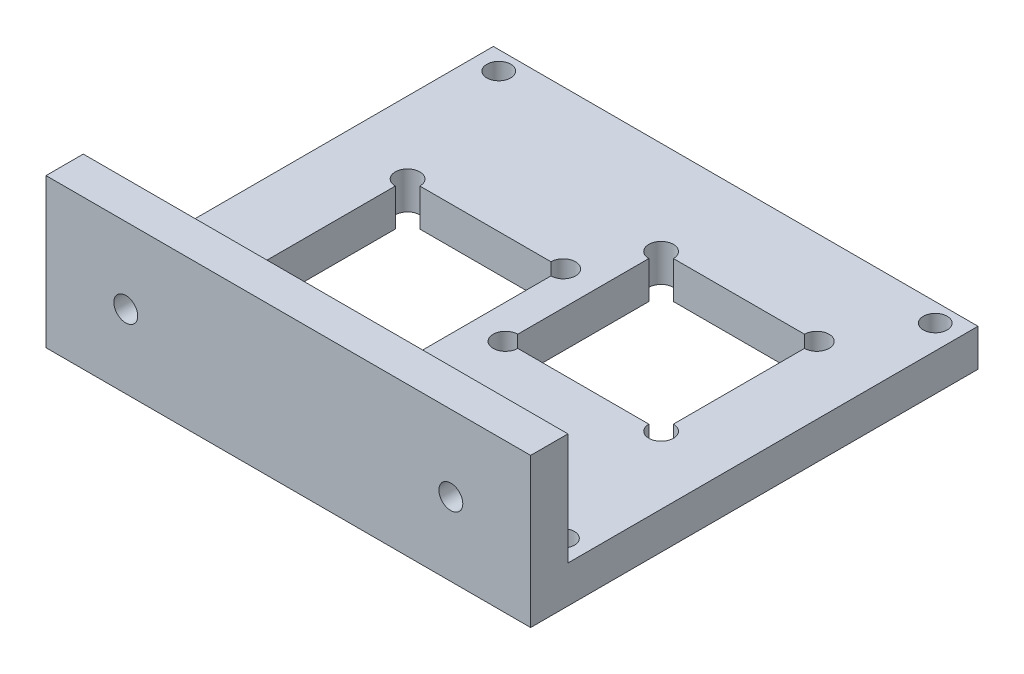
ISO-10303-21;
HEADER;
FILE_DESCRIPTION(('STEP AP214'),'2;1');
FILE_NAME('part.step','',(''),(''),'','','');
FILE_SCHEMA(('AUTOMOTIVE_DESIGN { 1 0 10303 214 1 1 1 1 }'));
ENDSEC;
DATA;
#1=APPLICATION_CONTEXT('core data for automotive mechanical design processes');
#2=APPLICATION_PROTOCOL_DEFINITION('international standard','automotive_design',2000,#1);
#3=PRODUCT_CONTEXT('',#1,'mechanical');
#4=PRODUCT('Part','Part','',(#3));
#5=PRODUCT_RELATED_PRODUCT_CATEGORY('part','',(#4));
#6=PRODUCT_DEFINITION_FORMATION('','',#4);
#7=PRODUCT_DEFINITION_CONTEXT('part definition',#1,'design');
#8=PRODUCT_DEFINITION('design','',#6,#7);
#9=PRODUCT_DEFINITION_SHAPE('','',#8);
#10=(LENGTH_UNIT() NAMED_UNIT(*) SI_UNIT(.MILLI.,.METRE.));
#11=(NAMED_UNIT(*) PLANE_ANGLE_UNIT() SI_UNIT($,.RADIAN.));
#12=(NAMED_UNIT(*) SI_UNIT($,.STERADIAN.) SOLID_ANGLE_UNIT());
#13=UNCERTAINTY_MEASURE_WITH_UNIT(LENGTH_MEASURE(1.E-05),#10,'distance_accuracy_value','');
#14=(GEOMETRIC_REPRESENTATION_CONTEXT(3) GLOBAL_UNCERTAINTY_ASSIGNED_CONTEXT((#13)) GLOBAL_UNIT_ASSIGNED_CONTEXT((#10,
#11,#12)) REPRESENTATION_CONTEXT('',''));
#15=CARTESIAN_POINT('',(0.,0.,0.));
#16=DIRECTION('',(0.,0.,1.));
#17=DIRECTION('',(1.,0.,0.));
#18=AXIS2_PLACEMENT_3D('',#15,#16,#17);
#19=CARTESIAN_POINT('',(0.,5.,0.));
#20=DIRECTION('',(0.,1.,0.));
#21=DIRECTION('',(0.,0.,1.));
#22=AXIS2_PLACEMENT_3D('',#19,#20,#21);
#23=PLANE('',#22);
#24=CARTESIAN_POINT('',(29.4502152782406,5.,-11.5634424045139));
#25=DIRECTION('',(0.,1.,0.));
#26=DIRECTION('',(0.,0.,1.));
#27=AXIS2_PLACEMENT_3D('',#24,#25,#26);
#28=CIRCLE('',#27,1.65);
#29=CARTESIAN_POINT('',(29.4502152782406,5.,-9.91344240451395));
#30=VERTEX_POINT('',#29);
#31=CARTESIAN_POINT('',(27.8002152782406,5.,-11.5634424045139));
#32=VERTEX_POINT('',#31);
#33=EDGE_CURVE('E351',#30,#32,#28,.T.);
#34=ORIENTED_EDGE('',*,*,#33,.F.);
#35=DIRECTION('',(0.,0.,1.));
#36=VECTOR('',#35,1.);
#37=CARTESIAN_POINT('',(29.4502152782406,5.,0.));
#38=LINE('',#37,#36);
#39=CARTESIAN_POINT('',(29.4502152782406,5.,7.66655759548606));
#40=VERTEX_POINT('',#39);
#41=EDGE_CURVE('E348',#30,#40,#38,.T.);
#42=ORIENTED_EDGE('',*,*,#41,.T.);
#43=CARTESIAN_POINT('',(29.4502152782406,5.,9.31655759548605));
#44=DIRECTION('',(0.,1.,0.));
#45=DIRECTION('',(0.,0.,1.));
#46=AXIS2_PLACEMENT_3D('',#43,#44,#45);
#47=CIRCLE('',#46,1.65);
#48=CARTESIAN_POINT('',(27.8002152782406,5.,9.31655759548605));
#49=VERTEX_POINT('',#48);
#50=EDGE_CURVE('E345',#49,#40,#47,.T.);
#51=ORIENTED_EDGE('',*,*,#50,.F.);
#52=DIRECTION('',(1.,0.,0.));
#53=VECTOR('',#52,1.);
#54=CARTESIAN_POINT('',(0.,5.,9.31655759548605));
#55=LINE('',#54,#53);
#56=CARTESIAN_POINT('',(10.2202152782406,5.,9.31655759548605));
#57=VERTEX_POINT('',#56);
#58=EDGE_CURVE('E341',#57,#49,#55,.T.);
#59=ORIENTED_EDGE('',*,*,#58,.F.);
#60=CARTESIAN_POINT('',(8.57021527824058,5.,9.31655759548605));
#61=DIRECTION('',(0.,1.,0.));
#62=DIRECTION('',(0.,0.,1.));
#63=AXIS2_PLACEMENT_3D('',#60,#61,#62);
#64=CIRCLE('',#63,1.65);
#65=CARTESIAN_POINT('',(8.57021527824058,5.,7.66655759548605));
#66=VERTEX_POINT('',#65);
#67=EDGE_CURVE('E338',#66,#57,#64,.T.);
#68=ORIENTED_EDGE('',*,*,#67,.F.);
#69=DIRECTION('',(0.,0.,1.));
#70=VECTOR('',#69,1.);
#71=CARTESIAN_POINT('',(8.57021527824058,5.,0.));
#72=LINE('',#71,#70);
#73=CARTESIAN_POINT('',(8.57021527824058,5.,-9.91344240451394));
#74=VERTEX_POINT('',#73);
#75=EDGE_CURVE('E321',#74,#66,#72,.T.);
#76=ORIENTED_EDGE('',*,*,#75,.F.);
#77=CARTESIAN_POINT('',(8.57021527824058,5.,-11.5634424045139));
#78=DIRECTION('',(0.,1.,0.));
#79=DIRECTION('',(0.,0.,1.));
#80=AXIS2_PLACEMENT_3D('',#77,#78,#79);
#81=CIRCLE('',#80,1.65);
#82=CARTESIAN_POINT('',(10.2202152782406,5.,-11.5634424045139));
#83=VERTEX_POINT('',#82);
#84=EDGE_CURVE('E375',#83,#74,#81,.T.);
#85=ORIENTED_EDGE('',*,*,#84,.F.);
#86=DIRECTION('',(1.,0.,0.));
#87=VECTOR('',#86,1.);
#88=CARTESIAN_POINT('',(0.,5.,-11.5634424045139));
#89=LINE('',#88,#87);
#90=EDGE_CURVE('E124',#83,#32,#89,.T.);
#91=ORIENTED_EDGE('',*,*,#90,.T.);
#92=EDGE_LOOP('',(#34,#42,#51,#59,#68,#76,#85,#91));
#93=FACE_BOUND('',#92,.T.);
#94=CARTESIAN_POINT('',(4.02883519362362,5.,-2.97875393495308));
#95=DIRECTION('',(0.,1.,0.));
#96=DIRECTION('',(0.,0.,1.));
#97=AXIS2_PLACEMENT_3D('',#94,#95,#96);
#98=CIRCLE('',#97,1.65);
#99=CARTESIAN_POINT('',(4.02883519362362,5.,-1.32875393495308));
#100=VERTEX_POINT('',#99);
#101=CARTESIAN_POINT('',(2.37883519362362,5.,-2.97875393495308));
#102=VERTEX_POINT('',#101);
#103=EDGE_CURVE('E409',#100,#102,#98,.T.);
#104=ORIENTED_EDGE('',*,*,#103,.F.);
#105=DIRECTION('',(0.,0.,1.));
#106=VECTOR('',#105,1.);
#107=CARTESIAN_POINT('',(4.02883519362362,5.,0.));
#108=LINE('',#107,#106);
#109=CARTESIAN_POINT('',(4.02883519362363,5.,16.2512460650469));
#110=VERTEX_POINT('',#109);
#111=EDGE_CURVE('E412',#100,#110,#108,.T.);
#112=ORIENTED_EDGE('',*,*,#111,.T.);
#113=CARTESIAN_POINT('',(4.02883519362363,5.,17.9012460650469));
#114=DIRECTION('',(0.,1.,0.));
#115=DIRECTION('',(0.,0.,1.));
#116=AXIS2_PLACEMENT_3D('',#113,#114,#115);
#117=CIRCLE('',#116,1.65);
#118=CARTESIAN_POINT('',(2.37883519362363,5.,17.9012460650469));
#119=VERTEX_POINT('',#118);
#120=EDGE_CURVE('E415',#119,#110,#117,.T.);
#121=ORIENTED_EDGE('',*,*,#120,.F.);
#122=DIRECTION('',(1.,0.,0.));
#123=VECTOR('',#122,1.);
#124=CARTESIAN_POINT('',(0.,5.,17.9012460650469));
#125=LINE('',#124,#123);
#126=CARTESIAN_POINT('',(-15.2011648063764,5.,17.9012460650469));
#127=VERTEX_POINT('',#126);
#128=EDGE_CURVE('E418',#127,#119,#125,.T.);
#129=ORIENTED_EDGE('',*,*,#128,.F.);
#130=CARTESIAN_POINT('',(-16.8511648063764,5.,17.9012460650469));
#131=DIRECTION('',(0.,1.,0.));
#132=DIRECTION('',(0.,0.,1.));
#133=AXIS2_PLACEMENT_3D('',#130,#131,#132);
#134=CIRCLE('',#133,1.65);
#135=CARTESIAN_POINT('',(-16.8511648063764,5.,16.2512460650469));
#136=VERTEX_POINT('',#135);
#137=EDGE_CURVE('E384',#136,#127,#134,.T.);
#138=ORIENTED_EDGE('',*,*,#137,.F.);
#139=DIRECTION('',(0.,0.,1.));
#140=VECTOR('',#139,1.);
#141=CARTESIAN_POINT('',(-16.8511648063764,5.,0.));
#142=LINE('',#141,#140);
#143=CARTESIAN_POINT('',(-16.8511648063764,5.,-1.32875393495308));
#144=VERTEX_POINT('',#143);
#145=EDGE_CURVE('E402',#144,#136,#142,.T.);
#146=ORIENTED_EDGE('',*,*,#145,.F.);
#147=CARTESIAN_POINT('',(-16.8511648063764,5.,-2.97875393495308));
#148=DIRECTION('',(0.,1.,0.));
#149=DIRECTION('',(0.,0.,1.));
#150=AXIS2_PLACEMENT_3D('',#147,#148,#149);
#151=CIRCLE('',#150,1.65);
#152=CARTESIAN_POINT('',(-15.2011648063764,5.,-2.97875393495308));
#153=VERTEX_POINT('',#152);
#154=EDGE_CURVE('E378',#153,#144,#151,.T.);
#155=ORIENTED_EDGE('',*,*,#154,.F.);
#156=DIRECTION('',(1.,0.,0.));
#157=VECTOR('',#156,1.);
#158=CARTESIAN_POINT('',(0.,5.,-2.97875393495308));
#159=LINE('',#158,#157);
#160=EDGE_CURVE('E405',#153,#102,#159,.T.);
#161=ORIENTED_EDGE('',*,*,#160,.T.);
#162=EDGE_LOOP('',(#104,#112,#121,#129,#138,#146,#155,#161));
#163=FACE_BOUND('',#162,.T.);
#164=CARTESIAN_POINT('',(35.2802152782406,5.,28.3765575954861));
#165=DIRECTION('',(0.,1.,0.));
#166=DIRECTION('',(0.,0.,1.));
#167=AXIS2_PLACEMENT_3D('',#164,#165,#166);
#168=CIRCLE('',#167,1.6);
#169=CARTESIAN_POINT('',(35.2802152782406,5.,29.976557595486));
#170=VERTEX_POINT('',#169);
#171=EDGE_CURVE('E455',#170,#170,#168,.T.);
#172=ORIENTED_EDGE('',*,*,#171,.F.);
#173=EDGE_LOOP('',(#172));
#174=FACE_BOUND('',#173,.T.);
#175=CARTESIAN_POINT('',(-23.2597847217594,5.,28.3765575954861));
#176=DIRECTION('',(0.,1.,0.));
#177=DIRECTION('',(0.,0.,1.));
#178=AXIS2_PLACEMENT_3D('',#175,#176,#177);
#179=CIRCLE('',#178,1.6);
#180=CARTESIAN_POINT('',(-23.2597847217594,5.,29.9765575954861));
#181=VERTEX_POINT('',#180);
#182=EDGE_CURVE('E458',#181,#181,#179,.T.);
#183=ORIENTED_EDGE('',*,*,#182,.F.);
#184=EDGE_LOOP('',(#183));
#185=FACE_BOUND('',#184,.T.);
#186=CARTESIAN_POINT('',(-23.2597847217594,5.,-21.6234424045139));
#187=DIRECTION('',(0.,1.,0.));
#188=DIRECTION('',(0.,0.,1.));
#189=AXIS2_PLACEMENT_3D('',#186,#187,#188);
#190=CIRCLE('',#189,1.6);
#191=CARTESIAN_POINT('',(-23.2597847217594,5.,-20.023442404514));
#192=VERTEX_POINT('',#191);
#193=EDGE_CURVE('E461',#192,#192,#190,.T.);
#194=ORIENTED_EDGE('',*,*,#193,.F.);
#195=EDGE_LOOP('',(#194));
#196=FACE_BOUND('',#195,.T.);
#197=CARTESIAN_POINT('',(35.2802152782406,5.,-21.6234424045139));
#198=DIRECTION('',(0.,1.,0.));
#199=DIRECTION('',(0.,0.,1.));
#200=AXIS2_PLACEMENT_3D('',#197,#198,#199);
#201=CIRCLE('',#200,1.6);
#202=CARTESIAN_POINT('',(35.2802152782406,5.,-20.023442404514));
#203=VERTEX_POINT('',#202);
#204=EDGE_CURVE('E464',#203,#203,#201,.T.);
#205=ORIENTED_EDGE('',*,*,#204,.F.);
#206=EDGE_LOOP('',(#205));
#207=FACE_BOUND('',#206,.T.);
#208=DIRECTION('',(0.,0.,-1.));
#209=VECTOR('',#208,1.);
#210=CARTESIAN_POINT('',(-26.4897847217594,5.,0.));
#211=LINE('',#210,#209);
#212=CARTESIAN_POINT('',(-26.4897847217594,5.,30.8765575954861));
#213=VERTEX_POINT('',#212);
#214=CARTESIAN_POINT('',(-26.4897847217594,5.,-24.1234424045139));
#215=VERTEX_POINT('',#214);
#216=EDGE_CURVE('E453',#213,#215,#211,.T.);
#217=ORIENTED_EDGE('',*,*,#216,.F.);
#218=DIRECTION('',(1.,0.,0.));
#219=VECTOR('',#218,1.);
#220=CARTESIAN_POINT('',(-26.4897847217594,5.,30.8765575954861));
#221=LINE('',#220,#219);
#222=CARTESIAN_POINT('',(-19.9897847217594,5.,30.8765575954861));
#223=VERTEX_POINT('',#222);
#224=EDGE_CURVE('E110',#213,#223,#221,.T.);
#225=ORIENTED_EDGE('',*,*,#224,.T.);
#226=DIRECTION('',(0.,0.,1.));
#227=VECTOR('',#226,1.);
#228=CARTESIAN_POINT('',(-19.9897847217594,5.,0.));
#229=LINE('',#228,#227);
#230=CARTESIAN_POINT('',(-19.9897847217594,5.,25.8765575954861));
#231=VERTEX_POINT('',#230);
#232=EDGE_CURVE('E440',#231,#223,#229,.T.);
#233=ORIENTED_EDGE('',*,*,#232,.F.);
#234=DIRECTION('',(1.,0.,0.));
#235=VECTOR('',#234,1.);
#236=CARTESIAN_POINT('',(0.,5.,25.8765575954861));
#237=LINE('',#236,#235);
#238=CARTESIAN_POINT('',(32.0102152782406,5.,25.8765575954861));
#239=VERTEX_POINT('',#238);
#240=EDGE_CURVE('E443',#231,#239,#237,.T.);
#241=ORIENTED_EDGE('',*,*,#240,.T.);
#242=DIRECTION('',(0.,0.,1.));
#243=VECTOR('',#242,1.);
#244=CARTESIAN_POINT('',(32.0102152782406,5.,0.));
#245=LINE('',#244,#243);
#246=CARTESIAN_POINT('',(32.0102152782406,5.,30.8765575954861));
#247=VERTEX_POINT('',#246);
#248=EDGE_CURVE('E446',#239,#247,#245,.T.);
#249=ORIENTED_EDGE('',*,*,#248,.T.);
#250=CARTESIAN_POINT('',(38.5102152782406,5.,30.8765575954861));
#251=VERTEX_POINT('',#250);
#252=EDGE_CURVE('E12',#247,#251,#221,.T.);
#253=ORIENTED_EDGE('',*,*,#252,.T.);
#254=DIRECTION('',(0.,0.,-1.));
#255=VECTOR('',#254,1.);
#256=CARTESIAN_POINT('',(38.5102152782406,5.,0.));
#257=LINE('',#256,#255);
#258=CARTESIAN_POINT('',(38.5102152782406,5.,-24.1234424045139));
#259=VERTEX_POINT('',#258);
#260=EDGE_CURVE('E290',#251,#259,#257,.T.);
#261=ORIENTED_EDGE('',*,*,#260,.T.);
#262=DIRECTION('',(1.,0.,0.));
#263=VECTOR('',#262,1.);
#264=CARTESIAN_POINT('',(0.,5.,-24.1234424045139));
#265=LINE('',#264,#263);
#266=EDGE_CURVE('E450',#215,#259,#265,.T.);
#267=ORIENTED_EDGE('',*,*,#266,.F.);
#268=EDGE_LOOP('',(#217,#225,#233,#241,#249,#253,#261,#267));
#269=FACE_BOUND('',#268,.T.);
#270=ADVANCED_FACE('F99',(#93,#163,#174,#185,#196,#207,#269),#23,.T.);
#271=CARTESIAN_POINT('',(-19.9897847217594,5.,0.));
#272=DIRECTION('',(1.,0.,0.));
#273=DIRECTION('',(0.,0.,-1.));
#274=AXIS2_PLACEMENT_3D('',#271,#272,#273);
#275=PLANE('',#274);
#276=DIRECTION('',(0.,0.,1.));
#277=VECTOR('',#276,1.);
#278=CARTESIAN_POINT('',(-19.9897847217594,0.,0.));
#279=LINE('',#278,#277);
#280=CARTESIAN_POINT('',(-19.9897847217594,0.,25.8765575954861));
#281=VERTEX_POINT('',#280);
#282=CARTESIAN_POINT('',(-19.9897847217594,0.,30.8765575954861));
#283=VERTEX_POINT('',#282);
#284=EDGE_CURVE('E359',#281,#283,#279,.T.);
#285=ORIENTED_EDGE('',*,*,#284,.F.);
#286=DIRECTION('',(0.,-1.,0.));
#287=VECTOR('',#286,1.);
#288=CARTESIAN_POINT('',(-19.9897847217594,5.,25.8765575954861));
#289=LINE('',#288,#287);
#290=EDGE_CURVE('E501',#231,#281,#289,.T.);
#291=ORIENTED_EDGE('',*,*,#290,.F.);
#292=ORIENTED_EDGE('',*,*,#232,.T.);
#293=DIRECTION('',(0.,-1.,0.));
#294=VECTOR('',#293,1.);
#295=CARTESIAN_POINT('',(-19.9897847217594,5.,30.8765575954861));
#296=LINE('',#295,#294);
#297=EDGE_CURVE('E108',#223,#283,#296,.T.);
#298=ORIENTED_EDGE('',*,*,#297,.T.);
#299=EDGE_LOOP('',(#285,#291,#292,#298));
#300=FACE_BOUND('',#299,.T.);
#301=ADVANCED_FACE('F101',(#300),#275,.T.);
#302=CARTESIAN_POINT('',(0.,5.,25.8765575954861));
#303=DIRECTION('',(0.,0.,-1.));
#304=DIRECTION('',(-1.,0.,0.));
#305=AXIS2_PLACEMENT_3D('',#302,#303,#304);
#306=PLANE('',#305);
#307=DIRECTION('',(1.,0.,0.));
#308=VECTOR('',#307,1.);
#309=CARTESIAN_POINT('',(0.,0.,25.8765575954861));
#310=LINE('',#309,#308);
#311=CARTESIAN_POINT('',(32.0102152782406,0.,25.8765575954861));
#312=VERTEX_POINT('',#311);
#313=EDGE_CURVE('E469',#281,#312,#310,.T.);
#314=ORIENTED_EDGE('',*,*,#313,.T.);
#315=DIRECTION('',(0.,-1.,0.));
#316=VECTOR('',#315,1.);
#317=CARTESIAN_POINT('',(32.0102152782406,5.,25.8765575954861));
#318=LINE('',#317,#316);
#319=EDGE_CURVE('E498',#239,#312,#318,.T.);
#320=ORIENTED_EDGE('',*,*,#319,.F.);
#321=ORIENTED_EDGE('',*,*,#240,.F.);
#322=ORIENTED_EDGE('',*,*,#290,.T.);
#323=EDGE_LOOP('',(#314,#320,#321,#322));
#324=FACE_BOUND('',#323,.T.);
#325=ADVANCED_FACE('F545',(#324),#306,.F.);
#326=CARTESIAN_POINT('',(32.0102152782406,5.,0.));
#327=DIRECTION('',(1.,0.,0.));
#328=DIRECTION('',(0.,0.,-1.));
#329=AXIS2_PLACEMENT_3D('',#326,#327,#328);
#330=PLANE('',#329);
#331=DIRECTION('',(0.,0.,1.));
#332=VECTOR('',#331,1.);
#333=CARTESIAN_POINT('',(32.0102152782406,0.,0.));
#334=LINE('',#333,#332);
#335=CARTESIAN_POINT('',(32.0102152782406,0.,30.8765575954861));
#336=VERTEX_POINT('',#335);
#337=EDGE_CURVE('E471',#312,#336,#334,.T.);
#338=ORIENTED_EDGE('',*,*,#337,.T.);
#339=DIRECTION('',(0.,-1.,0.));
#340=VECTOR('',#339,1.);
#341=CARTESIAN_POINT('',(32.0102152782406,5.,30.8765575954861));
#342=LINE('',#341,#340);
#343=EDGE_CURVE('E495',#247,#336,#342,.T.);
#344=ORIENTED_EDGE('',*,*,#343,.F.);
#345=ORIENTED_EDGE('',*,*,#248,.F.);
#346=ORIENTED_EDGE('',*,*,#319,.T.);
#347=EDGE_LOOP('',(#338,#344,#345,#346));
#348=FACE_BOUND('',#347,.T.);
#349=ADVANCED_FACE('F585',(#348),#330,.F.);
#350=CARTESIAN_POINT('',(38.5102152782406,5.,0.));
#351=DIRECTION('',(-1.,0.,0.));
#352=DIRECTION('',(0.,0.,1.));
#353=AXIS2_PLACEMENT_3D('',#350,#351,#352);
#354=PLANE('',#353);
#355=DIRECTION('',(0.,0.,-1.));
#356=VECTOR('',#355,1.);
#357=CARTESIAN_POINT('',(38.5102152782406,0.,0.));
#358=LINE('',#357,#356);
#359=CARTESIAN_POINT('',(38.5102152782406,0.,35.8765575954861));
#360=VERTEX_POINT('',#359);
#361=CARTESIAN_POINT('',(38.5102152782406,0.,-24.1234424045139));
#362=VERTEX_POINT('',#361);
#363=EDGE_CURVE('E473',#360,#362,#358,.T.);
#364=ORIENTED_EDGE('',*,*,#363,.T.);
#365=DIRECTION('',(0.,-1.,0.));
#366=VECTOR('',#365,1.);
#367=CARTESIAN_POINT('',(38.5102152782406,5.,-24.1234424045139));
#368=LINE('',#367,#366);
#369=EDGE_CURVE('E493',#259,#362,#368,.T.);
#370=ORIENTED_EDGE('',*,*,#369,.F.);
#371=ORIENTED_EDGE('',*,*,#260,.F.);
#372=DIRECTION('',(0.,-1.,0.));
#373=VECTOR('',#372,1.);
#374=CARTESIAN_POINT('',(38.5102152782406,20.,30.8765575954861));
#375=LINE('',#374,#373);
#376=CARTESIAN_POINT('',(38.5102152782406,20.,30.8765575954861));
#377=VERTEX_POINT('',#376);
#378=EDGE_CURVE('E117',#377,#251,#375,.T.);
#379=ORIENTED_EDGE('',*,*,#378,.F.);
#380=DIRECTION('',(0.,0.,-1.));
#381=VECTOR('',#380,1.);
#382=CARTESIAN_POINT('',(38.5102152782406,20.,35.8765575954861));
#383=LINE('',#382,#381);
#384=CARTESIAN_POINT('',(38.5102152782406,20.,35.8765575954861));
#385=VERTEX_POINT('',#384);
#386=EDGE_CURVE('E276',#385,#377,#383,.T.);
#387=ORIENTED_EDGE('',*,*,#386,.F.);
#388=DIRECTION('',(0.,1.,0.));
#389=VECTOR('',#388,1.);
#390=CARTESIAN_POINT('',(38.5102152782406,5.,35.8765575954861));
#391=LINE('',#390,#389);
#392=EDGE_CURVE('E312',#360,#385,#391,.T.);
#393=ORIENTED_EDGE('',*,*,#392,.F.);
#394=EDGE_LOOP('',(#364,#370,#371,#379,#387,#393));
#395=FACE_BOUND('',#394,.T.);
#396=ADVANCED_FACE('F288',(#395),#354,.F.);
#397=CARTESIAN_POINT('',(0.,5.,-24.1234424045139));
#398=DIRECTION('',(0.,0.,-1.));
#399=DIRECTION('',(-1.,0.,0.));
#400=AXIS2_PLACEMENT_3D('',#397,#398,#399);
#401=PLANE('',#400);
#402=DIRECTION('',(1.,0.,0.));
#403=VECTOR('',#402,1.);
#404=CARTESIAN_POINT('',(0.,0.,-24.1234424045139));
#405=LINE('',#404,#403);
#406=CARTESIAN_POINT('',(-26.4897847217594,0.,-24.1234424045139));
#407=VERTEX_POINT('',#406);
#408=EDGE_CURVE('E475',#407,#362,#405,.T.);
#409=ORIENTED_EDGE('',*,*,#408,.F.);
#410=DIRECTION('',(0.,-1.,0.));
#411=VECTOR('',#410,1.);
#412=CARTESIAN_POINT('',(-26.4897847217594,5.,-24.1234424045139));
#413=LINE('',#412,#411);
#414=EDGE_CURVE('E467',#215,#407,#413,.T.);
#415=ORIENTED_EDGE('',*,*,#414,.F.);
#416=ORIENTED_EDGE('',*,*,#266,.T.);
#417=ORIENTED_EDGE('',*,*,#369,.T.);
#418=EDGE_LOOP('',(#409,#415,#416,#417));
#419=FACE_BOUND('',#418,.T.);
#420=ADVANCED_FACE('F568',(#419),#401,.T.);
#421=CARTESIAN_POINT('',(-23.2597847217594,5.,-21.6234424045139));
#422=DIRECTION('',(0.,-1.,0.));
#423=DIRECTION('',(0.,0.,-1.));
#424=AXIS2_PLACEMENT_3D('',#421,#422,#423);
#425=CYLINDRICAL_SURFACE('',#424,1.6);
#426=ORIENTED_EDGE('',*,*,#193,.T.);
#427=EDGE_LOOP('',(#426));
#428=FACE_BOUND('',#427,.T.);
#429=CARTESIAN_POINT('',(-23.2597847217594,0.,-21.6234424045139));
#430=DIRECTION('',(0.,1.,0.));
#431=DIRECTION('',(0.,0.,1.));
#432=AXIS2_PLACEMENT_3D('',#429,#430,#431);
#433=CIRCLE('',#432,1.6);
#434=CARTESIAN_POINT('',(-23.2597847217594,0.,-20.023442404514));
#435=VERTEX_POINT('',#434);
#436=EDGE_CURVE('E487',#435,#435,#433,.T.);
#437=ORIENTED_EDGE('',*,*,#436,.F.);
#438=EDGE_LOOP('',(#437));
#439=FACE_BOUND('',#438,.T.);
#440=ADVANCED_FACE('F564',(#428,#439),#425,.F.);
#441=CARTESIAN_POINT('',(-23.2597847217594,5.,28.3765575954861));
#442=DIRECTION('',(0.,-1.,0.));
#443=DIRECTION('',(0.,0.,-1.));
#444=AXIS2_PLACEMENT_3D('',#441,#442,#443);
#445=CYLINDRICAL_SURFACE('',#444,1.6);
#446=ORIENTED_EDGE('',*,*,#182,.T.);
#447=EDGE_LOOP('',(#446));
#448=FACE_BOUND('',#447,.T.);
#449=CARTESIAN_POINT('',(-23.2597847217594,0.,28.3765575954861));
#450=DIRECTION('',(0.,1.,0.));
#451=DIRECTION('',(0.,0.,1.));
#452=AXIS2_PLACEMENT_3D('',#449,#450,#451);
#453=CIRCLE('',#452,1.6);
#454=CARTESIAN_POINT('',(-23.2597847217594,0.,29.9765575954861));
#455=VERTEX_POINT('',#454);
#456=EDGE_CURVE('E484',#455,#455,#453,.T.);
#457=ORIENTED_EDGE('',*,*,#456,.F.);
#458=EDGE_LOOP('',(#457));
#459=FACE_BOUND('',#458,.T.);
#460=ADVANCED_FACE('F567',(#448,#459),#445,.F.);
#461=CARTESIAN_POINT('',(35.2802152782406,5.,28.3765575954861));
#462=DIRECTION('',(0.,-1.,0.));
#463=DIRECTION('',(0.,0.,-1.));
#464=AXIS2_PLACEMENT_3D('',#461,#462,#463);
#465=CYLINDRICAL_SURFACE('',#464,1.6);
#466=ORIENTED_EDGE('',*,*,#171,.T.);
#467=EDGE_LOOP('',(#466));
#468=FACE_BOUND('',#467,.T.);
#469=CARTESIAN_POINT('',(35.2802152782406,0.,28.3765575954861));
#470=DIRECTION('',(0.,1.,0.));
#471=DIRECTION('',(0.,0.,1.));
#472=AXIS2_PLACEMENT_3D('',#469,#470,#471);
#473=CIRCLE('',#472,1.6);
#474=CARTESIAN_POINT('',(35.2802152782406,0.,29.976557595486));
#475=VERTEX_POINT('',#474);
#476=EDGE_CURVE('E481',#475,#475,#473,.T.);
#477=ORIENTED_EDGE('',*,*,#476,.F.);
#478=EDGE_LOOP('',(#477));
#479=FACE_BOUND('',#478,.T.);
#480=ADVANCED_FACE('F572',(#468,#479),#465,.F.);
#481=CARTESIAN_POINT('',(-26.4897847217594,5.,0.));
#482=DIRECTION('',(-1.,0.,0.));
#483=DIRECTION('',(0.,0.,1.));
#484=AXIS2_PLACEMENT_3D('',#481,#482,#483);
#485=PLANE('',#484);
#486=DIRECTION('',(0.,0.,-1.));
#487=VECTOR('',#486,1.);
#488=CARTESIAN_POINT('',(-26.4897847217594,0.,0.));
#489=LINE('',#488,#487);
#490=CARTESIAN_POINT('',(-26.4897847217594,0.,35.8765575954861));
#491=VERTEX_POINT('',#490);
#492=EDGE_CURVE('E478',#491,#407,#489,.T.);
#493=ORIENTED_EDGE('',*,*,#492,.F.);
#494=DIRECTION('',(0.,-1.,0.));
#495=VECTOR('',#494,1.);
#496=CARTESIAN_POINT('',(-26.4897847217594,5.,35.8765575954861));
#497=LINE('',#496,#495);
#498=CARTESIAN_POINT('',(-26.4897847217594,20.,35.8765575954861));
#499=VERTEX_POINT('',#498);
#500=EDGE_CURVE('E306',#499,#491,#497,.T.);
#501=ORIENTED_EDGE('',*,*,#500,.F.);
#502=DIRECTION('',(0.,0.,-1.));
#503=VECTOR('',#502,1.);
#504=CARTESIAN_POINT('',(-26.4897847217594,20.,35.8765575954861));
#505=LINE('',#504,#503);
#506=CARTESIAN_POINT('',(-26.4897847217594,20.,30.8765575954861));
#507=VERTEX_POINT('',#506);
#508=EDGE_CURVE('E292',#499,#507,#505,.T.);
#509=ORIENTED_EDGE('',*,*,#508,.T.);
#510=DIRECTION('',(0.,-1.,0.));
#511=VECTOR('',#510,1.);
#512=CARTESIAN_POINT('',(-26.4897847217594,20.,30.8765575954861));
#513=LINE('',#512,#511);
#514=EDGE_CURVE('E291',#507,#213,#513,.T.);
#515=ORIENTED_EDGE('',*,*,#514,.T.);
#516=ORIENTED_EDGE('',*,*,#216,.T.);
#517=ORIENTED_EDGE('',*,*,#414,.T.);
#518=EDGE_LOOP('',(#493,#501,#509,#515,#516,#517));
#519=FACE_BOUND('',#518,.T.);
#520=ADVANCED_FACE('F562',(#519),#485,.T.);
#521=CARTESIAN_POINT('',(35.2802152782406,5.,-21.6234424045139));
#522=DIRECTION('',(0.,-1.,0.));
#523=DIRECTION('',(0.,0.,-1.));
#524=AXIS2_PLACEMENT_3D('',#521,#522,#523);
#525=CYLINDRICAL_SURFACE('',#524,1.6);
#526=ORIENTED_EDGE('',*,*,#204,.T.);
#527=EDGE_LOOP('',(#526));
#528=FACE_BOUND('',#527,.T.);
#529=CARTESIAN_POINT('',(35.2802152782406,0.,-21.6234424045139));
#530=DIRECTION('',(0.,1.,0.));
#531=DIRECTION('',(0.,0.,1.));
#532=AXIS2_PLACEMENT_3D('',#529,#530,#531);
#533=CIRCLE('',#532,1.6);
#534=CARTESIAN_POINT('',(35.2802152782406,0.,-20.023442404514));
#535=VERTEX_POINT('',#534);
#536=EDGE_CURVE('E444',#535,#535,#533,.T.);
#537=ORIENTED_EDGE('',*,*,#536,.F.);
#538=EDGE_LOOP('',(#537));
#539=FACE_BOUND('',#538,.T.);
#540=ADVANCED_FACE('F557',(#528,#539),#525,.F.);
#541=CARTESIAN_POINT('',(0.,0.,0.));
#542=DIRECTION('',(0.,1.,0.));
#543=DIRECTION('',(0.,0.,1.));
#544=AXIS2_PLACEMENT_3D('',#541,#542,#543);
#545=PLANE('',#544);
#546=ORIENTED_EDGE('',*,*,#284,.T.);
#547=DIRECTION('',(1.,0.,0.));
#548=VECTOR('',#547,1.);
#549=CARTESIAN_POINT('',(-26.4897847217594,0.,30.8765575954861));
#550=LINE('',#549,#548);
#551=EDGE_CURVE('E304',#283,#336,#550,.T.);
#552=ORIENTED_EDGE('',*,*,#551,.T.);
#553=ORIENTED_EDGE('',*,*,#337,.F.);
#554=ORIENTED_EDGE('',*,*,#313,.F.);
#555=EDGE_LOOP('',(#546,#552,#553,#554));
#556=FACE_BOUND('',#555,.T.);
#557=DIRECTION('',(0.,0.,1.));
#558=VECTOR('',#557,1.);
#559=CARTESIAN_POINT('',(29.4502152782406,0.,0.));
#560=LINE('',#559,#558);
#561=CARTESIAN_POINT('',(29.4502152782406,0.,-9.91344240451395));
#562=VERTEX_POINT('',#561);
#563=CARTESIAN_POINT('',(29.4502152782406,0.,7.66655759548606));
#564=VERTEX_POINT('',#563);
#565=EDGE_CURVE('E327',#562,#564,#560,.T.);
#566=ORIENTED_EDGE('',*,*,#565,.F.);
#567=CARTESIAN_POINT('',(29.4502152782406,0.,-11.5634424045139));
#568=DIRECTION('',(0.,1.,0.));
#569=DIRECTION('',(0.,0.,1.));
#570=AXIS2_PLACEMENT_3D('',#567,#568,#569);
#571=CIRCLE('',#570,1.65);
#572=CARTESIAN_POINT('',(27.8002152782406,0.,-11.5634424045139));
#573=VERTEX_POINT('',#572);
#574=EDGE_CURVE('E329',#562,#573,#571,.T.);
#575=ORIENTED_EDGE('',*,*,#574,.T.);
#576=DIRECTION('',(1.,0.,0.));
#577=VECTOR('',#576,1.);
#578=CARTESIAN_POINT('',(0.,0.,-11.5634424045139));
#579=LINE('',#578,#577);
#580=CARTESIAN_POINT('',(10.2202152782406,0.,-11.5634424045139));
#581=VERTEX_POINT('',#580);
#582=EDGE_CURVE('E332',#581,#573,#579,.T.);
#583=ORIENTED_EDGE('',*,*,#582,.F.);
#584=CARTESIAN_POINT('',(8.57021527824058,0.,-11.5634424045139));
#585=DIRECTION('',(0.,1.,0.));
#586=DIRECTION('',(0.,0.,1.));
#587=AXIS2_PLACEMENT_3D('',#584,#585,#586);
#588=CIRCLE('',#587,1.65);
#589=CARTESIAN_POINT('',(8.57021527824058,0.,-9.91344240451394));
#590=VERTEX_POINT('',#589);
#591=EDGE_CURVE('E342',#581,#590,#588,.T.);
#592=ORIENTED_EDGE('',*,*,#591,.T.);
#593=DIRECTION('',(0.,0.,1.));
#594=VECTOR('',#593,1.);
#595=CARTESIAN_POINT('',(8.57021527824058,0.,0.));
#596=LINE('',#595,#594);
#597=CARTESIAN_POINT('',(8.57021527824058,0.,7.66655759548605));
#598=VERTEX_POINT('',#597);
#599=EDGE_CURVE('E334',#590,#598,#596,.T.);
#600=ORIENTED_EDGE('',*,*,#599,.T.);
#601=CARTESIAN_POINT('',(8.57021527824058,0.,9.31655759548605));
#602=DIRECTION('',(0.,1.,0.));
#603=DIRECTION('',(0.,0.,1.));
#604=AXIS2_PLACEMENT_3D('',#601,#602,#603);
#605=CIRCLE('',#604,1.65);
#606=CARTESIAN_POINT('',(10.2202152782406,0.,9.31655759548605));
#607=VERTEX_POINT('',#606);
#608=EDGE_CURVE('E317',#598,#607,#605,.T.);
#609=ORIENTED_EDGE('',*,*,#608,.T.);
#610=DIRECTION('',(1.,0.,0.));
#611=VECTOR('',#610,1.);
#612=CARTESIAN_POINT('',(0.,0.,9.31655759548605));
#613=LINE('',#612,#611);
#614=CARTESIAN_POINT('',(27.8002152782406,0.,9.31655759548605));
#615=VERTEX_POINT('',#614);
#616=EDGE_CURVE('E320',#607,#615,#613,.T.);
#617=ORIENTED_EDGE('',*,*,#616,.T.);
#618=CARTESIAN_POINT('',(29.4502152782406,0.,9.31655759548605));
#619=DIRECTION('',(0.,1.,0.));
#620=DIRECTION('',(0.,0.,1.));
#621=AXIS2_PLACEMENT_3D('',#618,#619,#620);
#622=CIRCLE('',#621,1.65);
#623=EDGE_CURVE('E324',#615,#564,#622,.T.);
#624=ORIENTED_EDGE('',*,*,#623,.T.);
#625=EDGE_LOOP('',(#566,#575,#583,#592,#600,#609,#617,#624));
#626=FACE_BOUND('',#625,.T.);
#627=DIRECTION('',(0.,0.,1.));
#628=VECTOR('',#627,1.);
#629=CARTESIAN_POINT('',(4.02883519362362,0.,0.));
#630=LINE('',#629,#628);
#631=CARTESIAN_POINT('',(4.02883519362362,0.,-1.32875393495308));
#632=VERTEX_POINT('',#631);
#633=CARTESIAN_POINT('',(4.02883519362363,0.,16.2512460650469));
#634=VERTEX_POINT('',#633);
#635=EDGE_CURVE('E430',#632,#634,#630,.T.);
#636=ORIENTED_EDGE('',*,*,#635,.F.);
#637=CARTESIAN_POINT('',(4.02883519362362,0.,-2.97875393495308));
#638=DIRECTION('',(0.,1.,0.));
#639=DIRECTION('',(0.,0.,1.));
#640=AXIS2_PLACEMENT_3D('',#637,#638,#639);
#641=CIRCLE('',#640,1.65);
#642=CARTESIAN_POINT('',(2.37883519362362,0.,-2.97875393495308));
#643=VERTEX_POINT('',#642);
#644=EDGE_CURVE('E427',#632,#643,#641,.T.);
#645=ORIENTED_EDGE('',*,*,#644,.T.);
#646=DIRECTION('',(1.,0.,0.));
#647=VECTOR('',#646,1.);
#648=CARTESIAN_POINT('',(0.,0.,-2.97875393495308));
#649=LINE('',#648,#647);
#650=CARTESIAN_POINT('',(-15.2011648063764,0.,-2.97875393495308));
#651=VERTEX_POINT('',#650);
#652=EDGE_CURVE('E425',#651,#643,#649,.T.);
#653=ORIENTED_EDGE('',*,*,#652,.F.);
#654=CARTESIAN_POINT('',(-16.8511648063764,0.,-2.97875393495308));
#655=DIRECTION('',(0.,1.,0.));
#656=DIRECTION('',(0.,0.,1.));
#657=AXIS2_PLACEMENT_3D('',#654,#655,#656);
#658=CIRCLE('',#657,1.65);
#659=CARTESIAN_POINT('',(-16.8511648063764,0.,-1.32875393495308));
#660=VERTEX_POINT('',#659);
#661=EDGE_CURVE('E381',#651,#660,#658,.T.);
#662=ORIENTED_EDGE('',*,*,#661,.T.);
#663=DIRECTION('',(0.,0.,1.));
#664=VECTOR('',#663,1.);
#665=CARTESIAN_POINT('',(-16.8511648063764,0.,0.));
#666=LINE('',#665,#664);
#667=CARTESIAN_POINT('',(-16.8511648063764,0.,16.2512460650469));
#668=VERTEX_POINT('',#667);
#669=EDGE_CURVE('E387',#660,#668,#666,.T.);
#670=ORIENTED_EDGE('',*,*,#669,.T.);
#671=CARTESIAN_POINT('',(-16.8511648063764,0.,17.9012460650469));
#672=DIRECTION('',(0.,1.,0.));
#673=DIRECTION('',(0.,0.,1.));
#674=AXIS2_PLACEMENT_3D('',#671,#672,#673);
#675=CIRCLE('',#674,1.65);
#676=CARTESIAN_POINT('',(-15.2011648063764,0.,17.9012460650469));
#677=VERTEX_POINT('',#676);
#678=EDGE_CURVE('E406',#668,#677,#675,.T.);
#679=ORIENTED_EDGE('',*,*,#678,.T.);
#680=DIRECTION('',(1.,0.,0.));
#681=VECTOR('',#680,1.);
#682=CARTESIAN_POINT('',(0.,0.,17.9012460650469));
#683=LINE('',#682,#681);
#684=CARTESIAN_POINT('',(2.37883519362363,0.,17.9012460650469));
#685=VERTEX_POINT('',#684);
#686=EDGE_CURVE('E435',#677,#685,#683,.T.);
#687=ORIENTED_EDGE('',*,*,#686,.T.);
#688=CARTESIAN_POINT('',(4.02883519362363,0.,17.9012460650469));
#689=DIRECTION('',(0.,1.,0.));
#690=DIRECTION('',(0.,0.,1.));
#691=AXIS2_PLACEMENT_3D('',#688,#689,#690);
#692=CIRCLE('',#691,1.65);
#693=EDGE_CURVE('E432',#685,#634,#692,.T.);
#694=ORIENTED_EDGE('',*,*,#693,.T.);
#695=EDGE_LOOP('',(#636,#645,#653,#662,#670,#679,#687,#694));
#696=FACE_BOUND('',#695,.T.);
#697=DIRECTION('',(1.,0.,0.));
#698=VECTOR('',#697,1.);
#699=CARTESIAN_POINT('',(-26.4897847217594,0.,35.8765575954861));
#700=LINE('',#699,#698);
#701=EDGE_CURVE('E309',#491,#360,#700,.T.);
#702=ORIENTED_EDGE('',*,*,#701,.F.);
#703=ORIENTED_EDGE('',*,*,#492,.T.);
#704=ORIENTED_EDGE('',*,*,#408,.T.);
#705=ORIENTED_EDGE('',*,*,#363,.F.);
#706=EDGE_LOOP('',(#702,#703,#704,#705));
#707=FACE_BOUND('',#706,.T.);
#708=ORIENTED_EDGE('',*,*,#476,.T.);
#709=EDGE_LOOP('',(#708));
#710=FACE_BOUND('',#709,.T.);
#711=ORIENTED_EDGE('',*,*,#456,.T.);
#712=EDGE_LOOP('',(#711));
#713=FACE_BOUND('',#712,.T.);
#714=ORIENTED_EDGE('',*,*,#436,.T.);
#715=EDGE_LOOP('',(#714));
#716=FACE_BOUND('',#715,.T.);
#717=ORIENTED_EDGE('',*,*,#536,.T.);
#718=EDGE_LOOP('',(#717));
#719=FACE_BOUND('',#718,.T.);
#720=ADVANCED_FACE('F553',(#556,#626,#696,#707,#710,#713,#716,#719),#545,.F.);
#721=CARTESIAN_POINT('',(-16.8511648063764,0.,17.9012460650469));
#722=DIRECTION('',(0.,1.,0.));
#723=DIRECTION('',(0.,0.,1.));
#724=AXIS2_PLACEMENT_3D('',#721,#722,#723);
#725=CYLINDRICAL_SURFACE('',#724,1.65);
#726=ORIENTED_EDGE('',*,*,#137,.T.);
#727=DIRECTION('',(0.,1.,0.));
#728=VECTOR('',#727,1.);
#729=CARTESIAN_POINT('',(-15.2011648063764,0.,17.9012460650469));
#730=LINE('',#729,#728);
#731=EDGE_CURVE('E385',#677,#127,#730,.T.);
#732=ORIENTED_EDGE('',*,*,#731,.F.);
#733=ORIENTED_EDGE('',*,*,#678,.F.);
#734=DIRECTION('',(0.,1.,0.));
#735=VECTOR('',#734,1.);
#736=CARTESIAN_POINT('',(-16.8511648063764,0.,16.2512460650469));
#737=LINE('',#736,#735);
#738=EDGE_CURVE('E314',#668,#136,#737,.T.);
#739=ORIENTED_EDGE('',*,*,#738,.T.);
#740=EDGE_LOOP('',(#726,#732,#733,#739));
#741=FACE_BOUND('',#740,.T.);
#742=ADVANCED_FACE('F556',(#741),#725,.F.);
#743=CARTESIAN_POINT('',(-16.8511648063764,0.,0.));
#744=DIRECTION('',(-1.,0.,0.));
#745=DIRECTION('',(0.,0.,1.));
#746=AXIS2_PLACEMENT_3D('',#743,#744,#745);
#747=PLANE('',#746);
#748=ORIENTED_EDGE('',*,*,#145,.T.);
#749=ORIENTED_EDGE('',*,*,#738,.F.);
#750=ORIENTED_EDGE('',*,*,#669,.F.);
#751=DIRECTION('',(0.,1.,0.));
#752=VECTOR('',#751,1.);
#753=CARTESIAN_POINT('',(-16.8511648063764,0.,-1.32875393495308));
#754=LINE('',#753,#752);
#755=EDGE_CURVE('E399',#660,#144,#754,.T.);
#756=ORIENTED_EDGE('',*,*,#755,.T.);
#757=EDGE_LOOP('',(#748,#749,#750,#756));
#758=FACE_BOUND('',#757,.T.);
#759=ADVANCED_FACE('F551',(#758),#747,.F.);
#760=CARTESIAN_POINT('',(0.,0.,-2.97875393495308));
#761=DIRECTION('',(0.,0.,1.));
#762=DIRECTION('',(1.,0.,0.));
#763=AXIS2_PLACEMENT_3D('',#760,#761,#762);
#764=PLANE('',#763);
#765=ORIENTED_EDGE('',*,*,#160,.F.);
#766=DIRECTION('',(0.,1.,0.));
#767=VECTOR('',#766,1.);
#768=CARTESIAN_POINT('',(-15.2011648063764,0.,-2.97875393495308));
#769=LINE('',#768,#767);
#770=EDGE_CURVE('E396',#651,#153,#769,.T.);
#771=ORIENTED_EDGE('',*,*,#770,.F.);
#772=ORIENTED_EDGE('',*,*,#652,.T.);
#773=DIRECTION('',(0.,1.,0.));
#774=VECTOR('',#773,1.);
#775=CARTESIAN_POINT('',(2.37883519362362,0.,-2.97875393495308));
#776=LINE('',#775,#774);
#777=EDGE_CURVE('E394',#643,#102,#776,.T.);
#778=ORIENTED_EDGE('',*,*,#777,.T.);
#779=EDGE_LOOP('',(#765,#771,#772,#778));
#780=FACE_BOUND('',#779,.T.);
#781=ADVANCED_FACE('F643',(#780),#764,.T.);
#782=CARTESIAN_POINT('',(4.02883519362362,0.,-2.97875393495308));
#783=DIRECTION('',(0.,1.,0.));
#784=DIRECTION('',(0.,0.,1.));
#785=AXIS2_PLACEMENT_3D('',#782,#783,#784);
#786=CYLINDRICAL_SURFACE('',#785,1.65);
#787=ORIENTED_EDGE('',*,*,#103,.T.);
#788=ORIENTED_EDGE('',*,*,#777,.F.);
#789=ORIENTED_EDGE('',*,*,#644,.F.);
#790=DIRECTION('',(0.,1.,0.));
#791=VECTOR('',#790,1.);
#792=CARTESIAN_POINT('',(4.02883519362362,0.,-1.32875393495308));
#793=LINE('',#792,#791);
#794=EDGE_CURVE('E392',#632,#100,#793,.T.);
#795=ORIENTED_EDGE('',*,*,#794,.T.);
#796=EDGE_LOOP('',(#787,#788,#789,#795));
#797=FACE_BOUND('',#796,.T.);
#798=ADVANCED_FACE('F641',(#797),#786,.F.);
#799=CARTESIAN_POINT('',(4.02883519362362,0.,0.));
#800=DIRECTION('',(-1.,0.,0.));
#801=DIRECTION('',(0.,0.,1.));
#802=AXIS2_PLACEMENT_3D('',#799,#800,#801);
#803=PLANE('',#802);
#804=ORIENTED_EDGE('',*,*,#111,.F.);
#805=ORIENTED_EDGE('',*,*,#794,.F.);
#806=ORIENTED_EDGE('',*,*,#635,.T.);
#807=DIRECTION('',(0.,1.,0.));
#808=VECTOR('',#807,1.);
#809=CARTESIAN_POINT('',(4.02883519362363,0.,16.2512460650469));
#810=LINE('',#809,#808);
#811=EDGE_CURVE('E390',#634,#110,#810,.T.);
#812=ORIENTED_EDGE('',*,*,#811,.T.);
#813=EDGE_LOOP('',(#804,#805,#806,#812));
#814=FACE_BOUND('',#813,.T.);
#815=ADVANCED_FACE('F631',(#814),#803,.T.);
#816=CARTESIAN_POINT('',(4.02883519362363,0.,17.9012460650469));
#817=DIRECTION('',(0.,1.,0.));
#818=DIRECTION('',(0.,0.,1.));
#819=AXIS2_PLACEMENT_3D('',#816,#817,#818);
#820=CYLINDRICAL_SURFACE('',#819,1.65);
#821=ORIENTED_EDGE('',*,*,#120,.T.);
#822=ORIENTED_EDGE('',*,*,#811,.F.);
#823=ORIENTED_EDGE('',*,*,#693,.F.);
#824=DIRECTION('',(0.,1.,0.));
#825=VECTOR('',#824,1.);
#826=CARTESIAN_POINT('',(2.37883519362363,0.,17.9012460650469));
#827=LINE('',#826,#825);
#828=EDGE_CURVE('E388',#685,#119,#827,.T.);
#829=ORIENTED_EDGE('',*,*,#828,.T.);
#830=EDGE_LOOP('',(#821,#822,#823,#829));
#831=FACE_BOUND('',#830,.T.);
#832=ADVANCED_FACE('F633',(#831),#820,.F.);
#833=CARTESIAN_POINT('',(0.,0.,17.9012460650469));
#834=DIRECTION('',(0.,0.,1.));
#835=DIRECTION('',(1.,0.,0.));
#836=AXIS2_PLACEMENT_3D('',#833,#834,#835);
#837=PLANE('',#836);
#838=ORIENTED_EDGE('',*,*,#128,.T.);
#839=ORIENTED_EDGE('',*,*,#828,.F.);
#840=ORIENTED_EDGE('',*,*,#686,.F.);
#841=ORIENTED_EDGE('',*,*,#731,.T.);
#842=EDGE_LOOP('',(#838,#839,#840,#841));
#843=FACE_BOUND('',#842,.T.);
#844=ADVANCED_FACE('F533',(#843),#837,.F.);
#845=CARTESIAN_POINT('',(-16.8511648063764,0.,-2.97875393495308));
#846=DIRECTION('',(0.,1.,0.));
#847=DIRECTION('',(0.,0.,1.));
#848=AXIS2_PLACEMENT_3D('',#845,#846,#847);
#849=CYLINDRICAL_SURFACE('',#848,1.65);
#850=ORIENTED_EDGE('',*,*,#661,.F.);
#851=ORIENTED_EDGE('',*,*,#770,.T.);
#852=ORIENTED_EDGE('',*,*,#154,.T.);
#853=ORIENTED_EDGE('',*,*,#755,.F.);
#854=EDGE_LOOP('',(#850,#851,#852,#853));
#855=FACE_BOUND('',#854,.T.);
#856=ADVANCED_FACE('F559',(#855),#849,.F.);
#857=CARTESIAN_POINT('',(8.57021527824058,0.,9.31655759548605));
#858=DIRECTION('',(0.,1.,0.));
#859=DIRECTION('',(0.,0.,1.));
#860=AXIS2_PLACEMENT_3D('',#857,#858,#859);
#861=CYLINDRICAL_SURFACE('',#860,1.65);
#862=ORIENTED_EDGE('',*,*,#67,.T.);
#863=DIRECTION('',(0.,1.,0.));
#864=VECTOR('',#863,1.);
#865=CARTESIAN_POINT('',(10.2202152782406,0.,9.31655759548605));
#866=LINE('',#865,#864);
#867=EDGE_CURVE('E337',#607,#57,#866,.T.);
#868=ORIENTED_EDGE('',*,*,#867,.F.);
#869=ORIENTED_EDGE('',*,*,#608,.F.);
#870=DIRECTION('',(0.,1.,0.));
#871=VECTOR('',#870,1.);
#872=CARTESIAN_POINT('',(8.57021527824058,0.,7.66655759548605));
#873=LINE('',#872,#871);
#874=EDGE_CURVE('E357',#598,#66,#873,.T.);
#875=ORIENTED_EDGE('',*,*,#874,.T.);
#876=EDGE_LOOP('',(#862,#868,#869,#875));
#877=FACE_BOUND('',#876,.T.);
#878=ADVANCED_FACE('F532',(#877),#861,.F.);
#879=CARTESIAN_POINT('',(8.57021527824058,0.,0.));
#880=DIRECTION('',(-1.,0.,0.));
#881=DIRECTION('',(0.,0.,1.));
#882=AXIS2_PLACEMENT_3D('',#879,#880,#881);
#883=PLANE('',#882);
#884=ORIENTED_EDGE('',*,*,#75,.T.);
#885=ORIENTED_EDGE('',*,*,#874,.F.);
#886=ORIENTED_EDGE('',*,*,#599,.F.);
#887=DIRECTION('',(0.,1.,0.));
#888=VECTOR('',#887,1.);
#889=CARTESIAN_POINT('',(8.57021527824058,0.,-9.91344240451394));
#890=LINE('',#889,#888);
#891=EDGE_CURVE('E360',#590,#74,#890,.T.);
#892=ORIENTED_EDGE('',*,*,#891,.T.);
#893=EDGE_LOOP('',(#884,#885,#886,#892));
#894=FACE_BOUND('',#893,.T.);
#895=ADVANCED_FACE('F853',(#894),#883,.F.);
#896=CARTESIAN_POINT('',(0.,0.,-11.5634424045139));
#897=DIRECTION('',(0.,0.,1.));
#898=DIRECTION('',(1.,0.,0.));
#899=AXIS2_PLACEMENT_3D('',#896,#897,#898);
#900=PLANE('',#899);
#901=ORIENTED_EDGE('',*,*,#90,.F.);
#902=DIRECTION('',(0.,1.,0.));
#903=VECTOR('',#902,1.);
#904=CARTESIAN_POINT('',(10.2202152782406,0.,-11.5634424045139));
#905=LINE('',#904,#903);
#906=EDGE_CURVE('E362',#581,#83,#905,.T.);
#907=ORIENTED_EDGE('',*,*,#906,.F.);
#908=ORIENTED_EDGE('',*,*,#582,.T.);
#909=DIRECTION('',(0.,1.,0.));
#910=VECTOR('',#909,1.);
#911=CARTESIAN_POINT('',(27.8002152782406,0.,-11.5634424045139));
#912=LINE('',#911,#910);
#913=EDGE_CURVE('E364',#573,#32,#912,.T.);
#914=ORIENTED_EDGE('',*,*,#913,.T.);
#915=EDGE_LOOP('',(#901,#907,#908,#914));
#916=FACE_BOUND('',#915,.T.);
#917=ADVANCED_FACE('F842',(#916),#900,.T.);
#918=CARTESIAN_POINT('',(29.4502152782406,0.,-11.5634424045139));
#919=DIRECTION('',(0.,1.,0.));
#920=DIRECTION('',(0.,0.,1.));
#921=AXIS2_PLACEMENT_3D('',#918,#919,#920);
#922=CYLINDRICAL_SURFACE('',#921,1.65);
#923=ORIENTED_EDGE('',*,*,#33,.T.);
#924=ORIENTED_EDGE('',*,*,#913,.F.);
#925=ORIENTED_EDGE('',*,*,#574,.F.);
#926=DIRECTION('',(0.,1.,0.));
#927=VECTOR('',#926,1.);
#928=CARTESIAN_POINT('',(29.4502152782406,0.,-9.91344240451395));
#929=LINE('',#928,#927);
#930=EDGE_CURVE('E366',#562,#30,#929,.T.);
#931=ORIENTED_EDGE('',*,*,#930,.T.);
#932=EDGE_LOOP('',(#923,#924,#925,#931));
#933=FACE_BOUND('',#932,.T.);
#934=ADVANCED_FACE('F831',(#933),#922,.F.);
#935=CARTESIAN_POINT('',(29.4502152782406,0.,0.));
#936=DIRECTION('',(-1.,0.,0.));
#937=DIRECTION('',(0.,0.,1.));
#938=AXIS2_PLACEMENT_3D('',#935,#936,#937);
#939=PLANE('',#938);
#940=ORIENTED_EDGE('',*,*,#41,.F.);
#941=ORIENTED_EDGE('',*,*,#930,.F.);
#942=ORIENTED_EDGE('',*,*,#565,.T.);
#943=DIRECTION('',(0.,1.,0.));
#944=VECTOR('',#943,1.);
#945=CARTESIAN_POINT('',(29.4502152782406,0.,7.66655759548606));
#946=LINE('',#945,#944);
#947=EDGE_CURVE('E368',#564,#40,#946,.T.);
#948=ORIENTED_EDGE('',*,*,#947,.T.);
#949=EDGE_LOOP('',(#940,#941,#942,#948));
#950=FACE_BOUND('',#949,.T.);
#951=ADVANCED_FACE('F820',(#950),#939,.T.);
#952=CARTESIAN_POINT('',(29.4502152782406,0.,9.31655759548605));
#953=DIRECTION('',(0.,1.,0.));
#954=DIRECTION('',(0.,0.,1.));
#955=AXIS2_PLACEMENT_3D('',#952,#953,#954);
#956=CYLINDRICAL_SURFACE('',#955,1.65);
#957=ORIENTED_EDGE('',*,*,#50,.T.);
#958=ORIENTED_EDGE('',*,*,#947,.F.);
#959=ORIENTED_EDGE('',*,*,#623,.F.);
#960=DIRECTION('',(0.,1.,0.));
#961=VECTOR('',#960,1.);
#962=CARTESIAN_POINT('',(27.8002152782406,0.,9.31655759548605));
#963=LINE('',#962,#961);
#964=EDGE_CURVE('E370',#615,#49,#963,.T.);
#965=ORIENTED_EDGE('',*,*,#964,.T.);
#966=EDGE_LOOP('',(#957,#958,#959,#965));
#967=FACE_BOUND('',#966,.T.);
#968=ADVANCED_FACE('F536',(#967),#956,.F.);
#969=CARTESIAN_POINT('',(0.,0.,9.31655759548605));
#970=DIRECTION('',(0.,0.,1.));
#971=DIRECTION('',(1.,0.,0.));
#972=AXIS2_PLACEMENT_3D('',#969,#970,#971);
#973=PLANE('',#972);
#974=ORIENTED_EDGE('',*,*,#58,.T.);
#975=ORIENTED_EDGE('',*,*,#964,.F.);
#976=ORIENTED_EDGE('',*,*,#616,.F.);
#977=ORIENTED_EDGE('',*,*,#867,.T.);
#978=EDGE_LOOP('',(#974,#975,#976,#977));
#979=FACE_BOUND('',#978,.T.);
#980=ADVANCED_FACE('F523',(#979),#973,.F.);
#981=CARTESIAN_POINT('',(8.57021527824058,0.,-11.5634424045139));
#982=DIRECTION('',(0.,1.,0.));
#983=DIRECTION('',(0.,0.,1.));
#984=AXIS2_PLACEMENT_3D('',#981,#982,#983);
#985=CYLINDRICAL_SURFACE('',#984,1.65);
#986=ORIENTED_EDGE('',*,*,#591,.F.);
#987=ORIENTED_EDGE('',*,*,#906,.T.);
#988=ORIENTED_EDGE('',*,*,#84,.T.);
#989=ORIENTED_EDGE('',*,*,#891,.F.);
#990=EDGE_LOOP('',(#986,#987,#988,#989));
#991=FACE_BOUND('',#990,.T.);
#992=ADVANCED_FACE('F520',(#991),#985,.F.);
#993=CARTESIAN_POINT('',(0.,0.,30.8765575954861));
#994=DIRECTION('',(0.,0.,1.));
#995=DIRECTION('',(1.,0.,0.));
#996=AXIS2_PLACEMENT_3D('',#993,#994,#995);
#997=PLANE('',#996);
#998=CARTESIAN_POINT('',(-15.7897847217594,9.83276338729685,30.8765575954861));
#999=DIRECTION('',(0.,0.,-1.));
#1000=DIRECTION('',(-1.,0.,0.));
#1001=AXIS2_PLACEMENT_3D('',#998,#999,#1000);
#1002=CIRCLE('',#1001,1.6);
#1003=CARTESIAN_POINT('',(-17.3897847217594,9.83276338729685,30.8765575954861));
#1004=VERTEX_POINT('',#1003);
#1005=EDGE_CURVE('E506',#1004,#1004,#1002,.T.);
#1006=ORIENTED_EDGE('',*,*,#1005,.F.);
#1007=EDGE_LOOP('',(#1006));
#1008=FACE_BOUND('',#1007,.T.);
#1009=CARTESIAN_POINT('',(27.8102152782406,9.83276338729685,30.8765575954861));
#1010=DIRECTION('',(0.,0.,-1.));
#1011=DIRECTION('',(-1.,0.,0.));
#1012=AXIS2_PLACEMENT_3D('',#1009,#1010,#1011);
#1013=CIRCLE('',#1012,1.6);
#1014=CARTESIAN_POINT('',(26.2102152782406,9.83276338729685,30.8765575954861));
#1015=VERTEX_POINT('',#1014);
#1016=EDGE_CURVE('E299',#1015,#1015,#1013,.T.);
#1017=ORIENTED_EDGE('',*,*,#1016,.F.);
#1018=EDGE_LOOP('',(#1017));
#1019=FACE_BOUND('',#1018,.T.);
#1020=ORIENTED_EDGE('',*,*,#297,.F.);
#1021=ORIENTED_EDGE('',*,*,#224,.F.);
#1022=ORIENTED_EDGE('',*,*,#514,.F.);
#1023=DIRECTION('',(1.,0.,0.));
#1024=VECTOR('',#1023,1.);
#1025=CARTESIAN_POINT('',(-26.4897847217594,20.,30.8765575954861));
#1026=LINE('',#1025,#1024);
#1027=EDGE_CURVE('E279',#507,#377,#1026,.T.);
#1028=ORIENTED_EDGE('',*,*,#1027,.T.);
#1029=ORIENTED_EDGE('',*,*,#378,.T.);
#1030=ORIENTED_EDGE('',*,*,#252,.F.);
#1031=ORIENTED_EDGE('',*,*,#343,.T.);
#1032=ORIENTED_EDGE('',*,*,#551,.F.);
#1033=EDGE_LOOP('',(#1020,#1021,#1022,#1028,#1029,#1030,#1031,#1032));
#1034=FACE_BOUND('',#1033,.T.);
#1035=ADVANCED_FACE('F295',(#1008,#1019,#1034),#997,.F.);
#1036=CARTESIAN_POINT('',(0.,0.,35.8765575954861));
#1037=DIRECTION('',(0.,0.,1.));
#1038=DIRECTION('',(1.,0.,0.));
#1039=AXIS2_PLACEMENT_3D('',#1036,#1037,#1038);
#1040=PLANE('',#1039);
#1041=CARTESIAN_POINT('',(-15.7897847217594,9.83276338729685,35.8765575954861));
#1042=DIRECTION('',(0.,0.,1.));
#1043=DIRECTION('',(1.,0.,0.));
#1044=AXIS2_PLACEMENT_3D('',#1041,#1042,#1043);
#1045=CIRCLE('',#1044,1.6);
#1046=CARTESIAN_POINT('',(-14.1897847217594,9.83276338729685,35.8765575954861));
#1047=VERTEX_POINT('',#1046);
#1048=EDGE_CURVE('E103',#1047,#1047,#1045,.T.);
#1049=ORIENTED_EDGE('',*,*,#1048,.F.);
#1050=EDGE_LOOP('',(#1049));
#1051=FACE_BOUND('',#1050,.T.);
#1052=CARTESIAN_POINT('',(27.8102152782406,9.83276338729685,35.8765575954861));
#1053=DIRECTION('',(0.,0.,1.));
#1054=DIRECTION('',(1.,0.,0.));
#1055=AXIS2_PLACEMENT_3D('',#1052,#1053,#1054);
#1056=CIRCLE('',#1055,1.6);
#1057=CARTESIAN_POINT('',(29.4102152782406,9.83276338729685,35.8765575954861));
#1058=VERTEX_POINT('',#1057);
#1059=EDGE_CURVE('E504',#1058,#1058,#1056,.T.);
#1060=ORIENTED_EDGE('',*,*,#1059,.F.);
#1061=EDGE_LOOP('',(#1060));
#1062=FACE_BOUND('',#1061,.T.);
#1063=ORIENTED_EDGE('',*,*,#500,.T.);
#1064=ORIENTED_EDGE('',*,*,#701,.T.);
#1065=ORIENTED_EDGE('',*,*,#392,.T.);
#1066=DIRECTION('',(1.,0.,0.));
#1067=VECTOR('',#1066,1.);
#1068=CARTESIAN_POINT('',(-26.4897847217594,20.,35.8765575954861));
#1069=LINE('',#1068,#1067);
#1070=EDGE_CURVE('E282',#499,#385,#1069,.T.);
#1071=ORIENTED_EDGE('',*,*,#1070,.F.);
#1072=EDGE_LOOP('',(#1063,#1064,#1065,#1071));
#1073=FACE_BOUND('',#1072,.T.);
#1074=ADVANCED_FACE('F519',(#1051,#1062,#1073),#1040,.T.);
#1075=CARTESIAN_POINT('',(0.,20.,0.));
#1076=DIRECTION('',(0.,1.,0.));
#1077=DIRECTION('',(0.,0.,1.));
#1078=AXIS2_PLACEMENT_3D('',#1075,#1076,#1077);
#1079=PLANE('',#1078);
#1080=ORIENTED_EDGE('',*,*,#1027,.F.);
#1081=ORIENTED_EDGE('',*,*,#508,.F.);
#1082=ORIENTED_EDGE('',*,*,#1070,.T.);
#1083=ORIENTED_EDGE('',*,*,#386,.T.);
#1084=EDGE_LOOP('',(#1080,#1081,#1082,#1083));
#1085=FACE_BOUND('',#1084,.T.);
#1086=ADVANCED_FACE('F277',(#1085),#1079,.T.);
#1087=CARTESIAN_POINT('',(27.8102152782406,9.83276338729685,45.8765575954861));
#1088=DIRECTION('',(0.,0.,-1.));
#1089=DIRECTION('',(-1.,0.,0.));
#1090=AXIS2_PLACEMENT_3D('',#1087,#1088,#1089);
#1091=CYLINDRICAL_SURFACE('',#1090,1.6);
#1092=ORIENTED_EDGE('',*,*,#1059,.T.);
#1093=EDGE_LOOP('',(#1092));
#1094=FACE_BOUND('',#1093,.T.);
#1095=ORIENTED_EDGE('',*,*,#1016,.T.);
#1096=EDGE_LOOP('',(#1095));
#1097=FACE_BOUND('',#1096,.T.);
#1098=ADVANCED_FACE('F516',(#1094,#1097),#1091,.F.);
#1099=CARTESIAN_POINT('',(-15.7897847217594,9.83276338729685,45.8765575954861));
#1100=DIRECTION('',(0.,0.,-1.));
#1101=DIRECTION('',(-1.,0.,0.));
#1102=AXIS2_PLACEMENT_3D('',#1099,#1100,#1101);
#1103=CYLINDRICAL_SURFACE('',#1102,1.6);
#1104=ORIENTED_EDGE('',*,*,#1048,.T.);
#1105=EDGE_LOOP('',(#1104));
#1106=FACE_BOUND('',#1105,.T.);
#1107=ORIENTED_EDGE('',*,*,#1005,.T.);
#1108=EDGE_LOOP('',(#1107));
#1109=FACE_BOUND('',#1108,.T.);
#1110=ADVANCED_FACE('F752',(#1106,#1109),#1103,.F.);
#1111=CLOSED_SHELL('',(#270,#301,#325,#349,#396,#420,#440,#460,#480,#520,#540,#720,#742,#759,
#781,#798,#815,#832,#844,#856,#878,#895,#917,#934,#951,#968,#980,#992,#1035,#1074,#1086,#1098,#1110));
#1112=MANIFOLD_SOLID_BREP('B2',#1111);
#1113=ADVANCED_BREP_SHAPE_REPRESENTATION('',(#18,#1112),#14);
#1114=SHAPE_DEFINITION_REPRESENTATION(#9,#1113);
ENDSEC;
END-ISO-10303-21;
